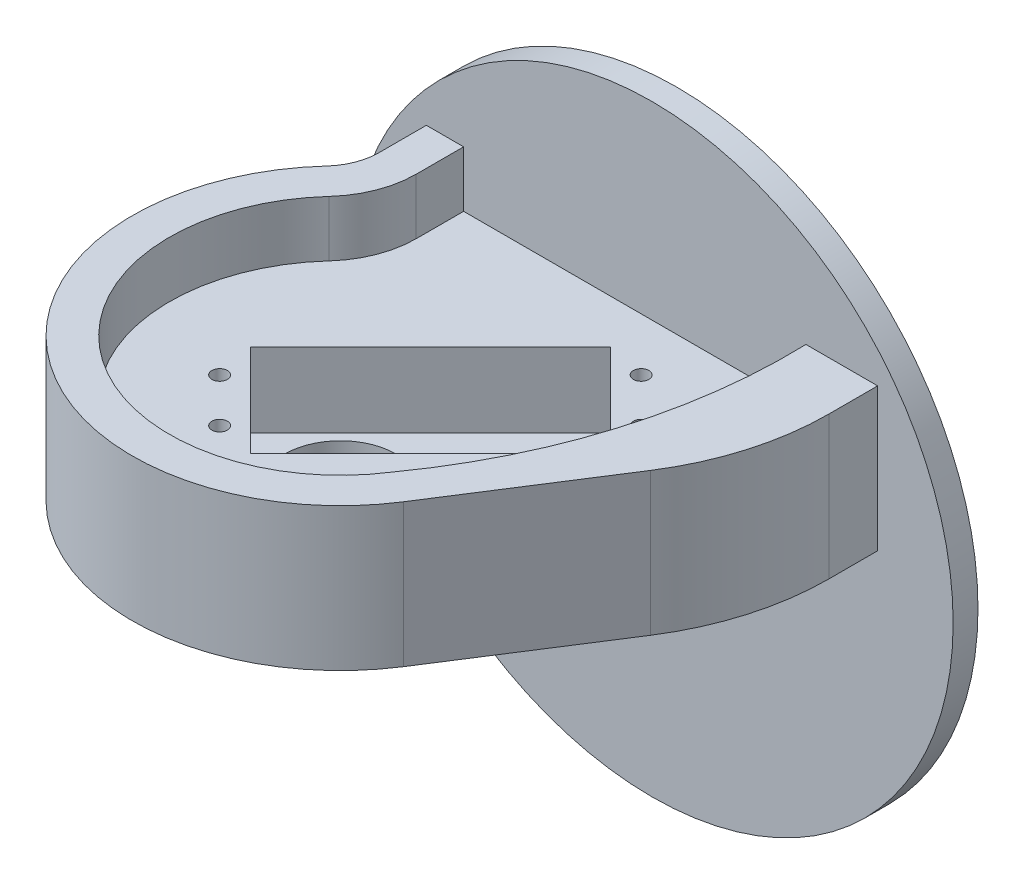
ISO-10303-21;
HEADER;
FILE_DESCRIPTION(('STEP AP214'),'2;1');
FILE_NAME('part.step','',(''),(''),'','','');
FILE_SCHEMA(('AUTOMOTIVE_DESIGN { 1 0 10303 214 1 1 1 1 }'));
ENDSEC;
DATA;
#1=APPLICATION_CONTEXT('core data for automotive mechanical design processes');
#2=APPLICATION_PROTOCOL_DEFINITION('international standard','automotive_design',2000,#1);
#3=PRODUCT_CONTEXT('',#1,'mechanical');
#4=PRODUCT('Part','Part','',(#3));
#5=PRODUCT_RELATED_PRODUCT_CATEGORY('part','',(#4));
#6=PRODUCT_DEFINITION_FORMATION('','',#4);
#7=PRODUCT_DEFINITION_CONTEXT('part definition',#1,'design');
#8=PRODUCT_DEFINITION('design','',#6,#7);
#9=PRODUCT_DEFINITION_SHAPE('','',#8);
#10=(LENGTH_UNIT() NAMED_UNIT(*) SI_UNIT(.MILLI.,.METRE.));
#11=(NAMED_UNIT(*) PLANE_ANGLE_UNIT() SI_UNIT($,.RADIAN.));
#12=(NAMED_UNIT(*) SI_UNIT($,.STERADIAN.) SOLID_ANGLE_UNIT());
#13=UNCERTAINTY_MEASURE_WITH_UNIT(LENGTH_MEASURE(1.E-05),#10,'distance_accuracy_value','');
#14=(GEOMETRIC_REPRESENTATION_CONTEXT(3) GLOBAL_UNCERTAINTY_ASSIGNED_CONTEXT((#13)) GLOBAL_UNIT_ASSIGNED_CONTEXT((#10,
#11,#12)) REPRESENTATION_CONTEXT('',''));
#15=CARTESIAN_POINT('',(0.,0.,0.));
#16=DIRECTION('',(0.,0.,1.));
#17=DIRECTION('',(1.,0.,0.));
#18=AXIS2_PLACEMENT_3D('',#15,#16,#17);
#19=CARTESIAN_POINT('',(-4.89,18.,11.86));
#20=DIRECTION('',(0.,-1.,0.));
#21=DIRECTION('',(0.,0.,-1.));
#22=AXIS2_PLACEMENT_3D('',#19,#20,#21);
#23=PLANE('',#22);
#24=DIRECTION('',(0.538635076023499,0.,-0.842539171123313));
#25=VECTOR('',#24,1.);
#26=CARTESIAN_POINT('',(24.7926549986743,18.,30.8361137283079));
#27=LINE('',#26,#25);
#28=CARTESIAN_POINT('',(9.27810564071832,18.,55.1041499893436));
#29=VERTEX_POINT('',#28);
#30=CARTESIAN_POINT('',(14.053379062148,18.,47.6346124685398));
#31=VERTEX_POINT('',#30);
#32=EDGE_CURVE('E304',#29,#31,#27,.T.);
#33=ORIENTED_EDGE('',*,*,#32,.T.);
#34=CARTESIAN_POINT('',(-58.1652068484387,18.,6.72647331414636));
#35=DIRECTION('',(0.,-1.,0.));
#36=DIRECTION('',(0.,0.,-1.));
#37=AXIS2_PLACEMENT_3D('',#34,#35,#36);
#38=CIRCLE('',#37,83.);
#39=CARTESIAN_POINT('',(24.79,18.,4.));
#40=VERTEX_POINT('',#39);
#41=EDGE_CURVE('E253',#31,#40,#38,.F.);
#42=ORIENTED_EDGE('',*,*,#41,.T.);
#43=DIRECTION('',(-1.,0.,0.));
#44=VECTOR('',#43,1.);
#45=CARTESIAN_POINT('',(-30.34,18.,4.));
#46=LINE('',#45,#44);
#47=CARTESIAN_POINT('',(-30.34,18.,4.));
#48=VERTEX_POINT('',#47);
#49=EDGE_CURVE('E292',#40,#48,#46,.T.);
#50=ORIENTED_EDGE('',*,*,#49,.T.);
#51=DIRECTION('',(0.,0.,1.));
#52=VECTOR('',#51,1.);
#53=CARTESIAN_POINT('',(-30.34,18.,4.));
#54=LINE('',#53,#52);
#55=CARTESIAN_POINT('',(-30.34,18.,11.64));
#56=VERTEX_POINT('',#55);
#57=EDGE_CURVE('E295',#48,#56,#54,.T.);
#58=ORIENTED_EDGE('',*,*,#57,.T.);
#59=CARTESIAN_POINT('',(-45.34,18.,11.64));
#60=DIRECTION('',(0.,-1.,0.));
#61=DIRECTION('',(0.,0.,-1.));
#62=AXIS2_PLACEMENT_3D('',#59,#60,#61);
#63=CIRCLE('',#62,15.);
#64=CARTESIAN_POINT('',(-34.2527184145767,18.,21.7430780975668));
#65=VERTEX_POINT('',#64);
#66=EDGE_CURVE('E299',#56,#65,#63,.T.);
#67=ORIENTED_EDGE('',*,*,#66,.T.);
#68=CARTESIAN_POINT('',(-13.91,18.,40.28));
#69=DIRECTION('',(0.,1.,0.));
#70=DIRECTION('',(0.,0.,1.));
#71=AXIS2_PLACEMENT_3D('',#68,#69,#70);
#72=CIRCLE('',#71,27.5216944629444);
#73=EDGE_CURVE('E302',#65,#29,#72,.T.);
#74=ORIENTED_EDGE('',*,*,#73,.T.);
#75=EDGE_LOOP('',(#33,#42,#50,#58,#67,#74));
#76=FACE_BOUND('',#75,.T.);
#77=DIRECTION('',(-0.707106781186547,0.,-0.707106781186548));
#78=VECTOR('',#77,1.);
#79=CARTESIAN_POINT('',(-1.86537879754133,18.,8.83537879754134));
#80=LINE('',#79,#78);
#81=CARTESIAN_POINT('',(15.2592424049174,18.,25.9600000000001));
#82=VERTEX_POINT('',#81);
#83=CARTESIAN_POINT('',(0.409999999999921,18.,11.1107575950826));
#84=VERTEX_POINT('',#83);
#85=EDGE_CURVE('E47',#82,#84,#80,.T.);
#86=ORIENTED_EDGE('',*,*,#85,.F.);
#87=DIRECTION('',(0.707106781186551,0.,-0.707106781186544));
#88=VECTOR('',#87,1.);
#89=CARTESIAN_POINT('',(12.2346212024587,18.,28.9846212024589));
#90=LINE('',#89,#88);
#91=CARTESIAN_POINT('',(-13.7321356237312,18.,54.9513780286484));
#92=VERTEX_POINT('',#91);
#93=EDGE_CURVE('E332',#92,#82,#90,.T.);
#94=ORIENTED_EDGE('',*,*,#93,.F.);
#95=DIRECTION('',(0.707106781186544,0.,0.707106781186551));
#96=VECTOR('',#95,1.);
#97=CARTESIAN_POINT('',(-30.8567568261899,18.,37.8267568261896));
#98=LINE('',#97,#96);
#99=CARTESIAN_POINT('',(-28.5813780286486,18.,40.1021356237308));
#100=VERTEX_POINT('',#99);
#101=EDGE_CURVE('E339',#100,#92,#98,.T.);
#102=ORIENTED_EDGE('',*,*,#101,.F.);
#103=DIRECTION('',(-0.707106781186551,0.,0.707106781186544));
#104=VECTOR('',#103,1.);
#105=CARTESIAN_POINT('',(-2.61462120245877,18.,14.1353787975413));
#106=LINE('',#105,#104);
#107=EDGE_CURVE('E342',#84,#100,#106,.T.);
#108=ORIENTED_EDGE('',*,*,#107,.F.);
#109=EDGE_LOOP('',(#86,#94,#102,#108));
#110=FACE_BOUND('',#109,.T.);
#111=CARTESIAN_POINT('',(-20.0960966544101,18.,53.5371644662753));
#112=DIRECTION('',(0.,-1.,0.));
#113=DIRECTION('',(0.,0.,-1.));
#114=AXIS2_PLACEMENT_3D('',#111,#112,#113);
#115=CIRCLE('',#114,1.25);
#116=CARTESIAN_POINT('',(-20.0960966544101,18.,52.2871644662753));
#117=VERTEX_POINT('',#116);
#118=EDGE_CURVE('E337',#117,#117,#115,.F.);
#119=ORIENTED_EDGE('',*,*,#118,.F.);
#120=EDGE_LOOP('',(#119));
#121=FACE_BOUND('',#120,.T.);
#122=CARTESIAN_POINT('',(-27.1671644662755,18.,46.4660966544098));
#123=DIRECTION('',(0.,-1.,0.));
#124=DIRECTION('',(0.,0.,-1.));
#125=AXIS2_PLACEMENT_3D('',#122,#123,#124);
#126=CIRCLE('',#125,1.25);
#127=CARTESIAN_POINT('',(-27.1671644662755,18.,45.2160966544098));
#128=VERTEX_POINT('',#127);
#129=EDGE_CURVE('E347',#128,#128,#126,.F.);
#130=ORIENTED_EDGE('',*,*,#129,.F.);
#131=EDGE_LOOP('',(#130));
#132=FACE_BOUND('',#131,.T.);
#133=CARTESIAN_POINT('',(6.7739610306791,18.,12.524971157456));
#134=DIRECTION('',(0.,-1.,0.));
#135=DIRECTION('',(0.,0.,-1.));
#136=AXIS2_PLACEMENT_3D('',#133,#134,#135);
#137=CIRCLE('',#136,1.25);
#138=CARTESIAN_POINT('',(6.7739610306791,18.,11.274971157456));
#139=VERTEX_POINT('',#138);
#140=EDGE_CURVE('E350',#139,#139,#137,.F.);
#141=ORIENTED_EDGE('',*,*,#140,.F.);
#142=EDGE_LOOP('',(#141));
#143=FACE_BOUND('',#142,.T.);
#144=CARTESIAN_POINT('',(13.8450288425444,18.,19.5960389693216));
#145=DIRECTION('',(0.,-1.,0.));
#146=DIRECTION('',(0.,0.,-1.));
#147=AXIS2_PLACEMENT_3D('',#144,#145,#146);
#148=CIRCLE('',#147,1.24999999999999);
#149=CARTESIAN_POINT('',(13.8450288425444,18.,18.3460389693216));
#150=VERTEX_POINT('',#149);
#151=EDGE_CURVE('E291',#150,#150,#148,.F.);
#152=ORIENTED_EDGE('',*,*,#151,.F.);
#153=EDGE_LOOP('',(#152));
#154=FACE_BOUND('',#153,.T.);
#155=ADVANCED_FACE('F39',(#76,#110,#121,#132,#143,#154),#23,.F.);
#156=CARTESIAN_POINT('',(0.,0.,4.));
#157=DIRECTION('',(0.,0.,1.));
#158=DIRECTION('',(1.,0.,0.));
#159=AXIS2_PLACEMENT_3D('',#156,#157,#158);
#160=PLANE('',#159);
#161=DIRECTION('',(0.,1.,0.));
#162=VECTOR('',#161,1.);
#163=CARTESIAN_POINT('',(36.34,-105.041154355093,4.));
#164=LINE('',#163,#162);
#165=CARTESIAN_POINT('',(36.34,4.,4.));
#166=VERTEX_POINT('',#165);
#167=CARTESIAN_POINT('',(36.34,27.,4.));
#168=VERTEX_POINT('',#167);
#169=EDGE_CURVE('E216',#166,#168,#164,.T.);
#170=ORIENTED_EDGE('',*,*,#169,.F.);
#171=DIRECTION('',(-1.,0.,0.));
#172=VECTOR('',#171,1.);
#173=CARTESIAN_POINT('',(-30.34,4.,4.));
#174=LINE('',#173,#172);
#175=CARTESIAN_POINT('',(-36.34,4.,4.));
#176=VERTEX_POINT('',#175);
#177=EDGE_CURVE('E54',#166,#176,#174,.T.);
#178=ORIENTED_EDGE('',*,*,#177,.T.);
#179=DIRECTION('',(0.,1.,0.));
#180=VECTOR('',#179,1.);
#181=CARTESIAN_POINT('',(-36.34,-105.041154355093,4.));
#182=LINE('',#181,#180);
#183=CARTESIAN_POINT('',(-36.34,27.,4.));
#184=VERTEX_POINT('',#183);
#185=EDGE_CURVE('E237',#176,#184,#182,.T.);
#186=ORIENTED_EDGE('',*,*,#185,.T.);
#187=DIRECTION('',(-1.,0.,0.));
#188=VECTOR('',#187,1.);
#189=CARTESIAN_POINT('',(-30.34,27.,4.));
#190=LINE('',#189,#188);
#191=CARTESIAN_POINT('',(-30.34,27.,4.));
#192=VERTEX_POINT('',#191);
#193=EDGE_CURVE('E193',#192,#184,#190,.T.);
#194=ORIENTED_EDGE('',*,*,#193,.F.);
#195=DIRECTION('',(0.,1.,0.));
#196=VECTOR('',#195,1.);
#197=CARTESIAN_POINT('',(-30.34,-105.041154355093,4.));
#198=LINE('',#197,#196);
#199=EDGE_CURVE('E247',#48,#192,#198,.T.);
#200=ORIENTED_EDGE('',*,*,#199,.F.);
#201=ORIENTED_EDGE('',*,*,#49,.F.);
#202=DIRECTION('',(0.,1.,0.));
#203=VECTOR('',#202,1.);
#204=CARTESIAN_POINT('',(24.79,-105.041154355093,4.));
#205=LINE('',#204,#203);
#206=CARTESIAN_POINT('',(24.79,27.,4.));
#207=VERTEX_POINT('',#206);
#208=EDGE_CURVE('E62',#40,#207,#205,.T.);
#209=ORIENTED_EDGE('',*,*,#208,.T.);
#210=DIRECTION('',(-1.,0.,0.));
#211=VECTOR('',#210,1.);
#212=CARTESIAN_POINT('',(30.34,27.,4.));
#213=LINE('',#212,#211);
#214=EDGE_CURVE('E181',#168,#207,#213,.T.);
#215=ORIENTED_EDGE('',*,*,#214,.F.);
#216=EDGE_LOOP('',(#170,#178,#186,#194,#200,#201,#209,#215));
#217=FACE_BOUND('',#216,.T.);
#218=CARTESIAN_POINT('',(0.,0.,4.));
#219=DIRECTION('',(0.,0.,1.));
#220=DIRECTION('',(1.,0.,0.));
#221=AXIS2_PLACEMENT_3D('',#218,#219,#220);
#222=CIRCLE('',#221,3.75);
#223=CARTESIAN_POINT('',(3.75,0.,4.));
#224=VERTEX_POINT('',#223);
#225=EDGE_CURVE('E310',#224,#224,#222,.T.);
#226=ORIENTED_EDGE('',*,*,#225,.F.);
#227=EDGE_LOOP('',(#226));
#228=FACE_BOUND('',#227,.T.);
#229=CARTESIAN_POINT('',(-7.25,0.,4.));
#230=DIRECTION('',(0.,0.,1.));
#231=DIRECTION('',(1.,0.,0.));
#232=AXIS2_PLACEMENT_3D('',#229,#230,#231);
#233=CIRCLE('',#232,1.5);
#234=CARTESIAN_POINT('',(-5.75,0.,4.));
#235=VERTEX_POINT('',#234);
#236=EDGE_CURVE('E323',#235,#235,#233,.T.);
#237=ORIENTED_EDGE('',*,*,#236,.F.);
#238=EDGE_LOOP('',(#237));
#239=FACE_BOUND('',#238,.T.);
#240=CARTESIAN_POINT('',(0.,0.,4.));
#241=DIRECTION('',(0.,0.,1.));
#242=DIRECTION('',(1.,0.,0.));
#243=AXIS2_PLACEMENT_3D('',#240,#241,#242);
#244=CIRCLE('',#243,48.5);
#245=CARTESIAN_POINT('',(48.5,0.,4.));
#246=VERTEX_POINT('',#245);
#247=EDGE_CURVE('E329',#246,#246,#244,.T.);
#248=ORIENTED_EDGE('',*,*,#247,.T.);
#249=EDGE_LOOP('',(#248));
#250=FACE_BOUND('',#249,.T.);
#251=CARTESIAN_POINT('',(7.25,0.,4.));
#252=DIRECTION('',(0.,0.,1.));
#253=DIRECTION('',(1.,0.,0.));
#254=AXIS2_PLACEMENT_3D('',#251,#252,#253);
#255=CIRCLE('',#254,1.5);
#256=CARTESIAN_POINT('',(8.75,0.,4.));
#257=VERTEX_POINT('',#256);
#258=EDGE_CURVE('E317',#257,#257,#255,.T.);
#259=ORIENTED_EDGE('',*,*,#258,.F.);
#260=EDGE_LOOP('',(#259));
#261=FACE_BOUND('',#260,.T.);
#262=ADVANCED_FACE('F358',(#217,#228,#239,#250,#261),#160,.T.);
#263=CARTESIAN_POINT('',(0.,0.,0.));
#264=DIRECTION('',(0.,0.,1.));
#265=DIRECTION('',(1.,0.,0.));
#266=AXIS2_PLACEMENT_3D('',#263,#264,#265);
#267=PLANE('',#266);
#268=CARTESIAN_POINT('',(0.,0.,0.));
#269=DIRECTION('',(0.,0.,1.));
#270=DIRECTION('',(1.,0.,0.));
#271=AXIS2_PLACEMENT_3D('',#268,#269,#270);
#272=CIRCLE('',#271,48.5);
#273=CARTESIAN_POINT('',(48.5,0.,0.));
#274=VERTEX_POINT('',#273);
#275=EDGE_CURVE('E326',#274,#274,#272,.T.);
#276=ORIENTED_EDGE('',*,*,#275,.F.);
#277=EDGE_LOOP('',(#276));
#278=FACE_BOUND('',#277,.T.);
#279=CARTESIAN_POINT('',(-7.25,0.,0.));
#280=DIRECTION('',(0.,0.,1.));
#281=DIRECTION('',(1.,0.,0.));
#282=AXIS2_PLACEMENT_3D('',#279,#280,#281);
#283=CIRCLE('',#282,1.5);
#284=CARTESIAN_POINT('',(-5.75,0.,0.));
#285=VERTEX_POINT('',#284);
#286=EDGE_CURVE('E320',#285,#285,#283,.T.);
#287=ORIENTED_EDGE('',*,*,#286,.T.);
#288=EDGE_LOOP('',(#287));
#289=FACE_BOUND('',#288,.T.);
#290=CARTESIAN_POINT('',(7.25,0.,0.));
#291=DIRECTION('',(0.,0.,1.));
#292=DIRECTION('',(1.,0.,0.));
#293=AXIS2_PLACEMENT_3D('',#290,#291,#292);
#294=CIRCLE('',#293,1.5);
#295=CARTESIAN_POINT('',(8.75,0.,0.));
#296=VERTEX_POINT('',#295);
#297=EDGE_CURVE('E314',#296,#296,#294,.T.);
#298=ORIENTED_EDGE('',*,*,#297,.T.);
#299=EDGE_LOOP('',(#298));
#300=FACE_BOUND('',#299,.T.);
#301=ADVANCED_FACE('F365',(#278,#289,#300),#267,.F.);
#302=CARTESIAN_POINT('',(0.,0.,4.));
#303=DIRECTION('',(0.,0.,-1.));
#304=DIRECTION('',(-1.,0.,0.));
#305=AXIS2_PLACEMENT_3D('',#302,#303,#304);
#306=CYLINDRICAL_SURFACE('',#305,48.5);
#307=ORIENTED_EDGE('',*,*,#247,.F.);
#308=EDGE_LOOP('',(#307));
#309=FACE_BOUND('',#308,.T.);
#310=ORIENTED_EDGE('',*,*,#275,.T.);
#311=EDGE_LOOP('',(#310));
#312=FACE_BOUND('',#311,.T.);
#313=ADVANCED_FACE('F41',(#309,#312),#306,.T.);
#314=CARTESIAN_POINT('',(-7.25,0.,4.));
#315=DIRECTION('',(0.,0.,-1.));
#316=DIRECTION('',(-1.,0.,0.));
#317=AXIS2_PLACEMENT_3D('',#314,#315,#316);
#318=CYLINDRICAL_SURFACE('',#317,1.5);
#319=ORIENTED_EDGE('',*,*,#236,.T.);
#320=EDGE_LOOP('',(#319));
#321=FACE_BOUND('',#320,.T.);
#322=ORIENTED_EDGE('',*,*,#286,.F.);
#323=EDGE_LOOP('',(#322));
#324=FACE_BOUND('',#323,.T.);
#325=ADVANCED_FACE('F390',(#321,#324),#318,.F.);
#326=CARTESIAN_POINT('',(7.25,0.,4.));
#327=DIRECTION('',(0.,0.,-1.));
#328=DIRECTION('',(-1.,0.,0.));
#329=AXIS2_PLACEMENT_3D('',#326,#327,#328);
#330=CYLINDRICAL_SURFACE('',#329,1.5);
#331=ORIENTED_EDGE('',*,*,#258,.T.);
#332=EDGE_LOOP('',(#331));
#333=FACE_BOUND('',#332,.T.);
#334=ORIENTED_EDGE('',*,*,#297,.F.);
#335=EDGE_LOOP('',(#334));
#336=FACE_BOUND('',#335,.T.);
#337=ADVANCED_FACE('F386',(#333,#336),#330,.F.);
#338=CARTESIAN_POINT('',(0.,0.,2.5));
#339=DIRECTION('',(0.,0.,1.));
#340=DIRECTION('',(1.,0.,0.));
#341=AXIS2_PLACEMENT_3D('',#338,#339,#340);
#342=CYLINDRICAL_SURFACE('',#341,3.75);
#343=CARTESIAN_POINT('',(0.,0.,2.5));
#344=DIRECTION('',(0.,0.,1.));
#345=DIRECTION('',(1.,0.,0.));
#346=AXIS2_PLACEMENT_3D('',#343,#344,#345);
#347=CIRCLE('',#346,3.75);
#348=CARTESIAN_POINT('',(3.75,0.,2.5));
#349=VERTEX_POINT('',#348);
#350=EDGE_CURVE('E311',#349,#349,#347,.T.);
#351=ORIENTED_EDGE('',*,*,#350,.F.);
#352=EDGE_LOOP('',(#351));
#353=FACE_BOUND('',#352,.T.);
#354=ORIENTED_EDGE('',*,*,#225,.T.);
#355=EDGE_LOOP('',(#354));
#356=FACE_BOUND('',#355,.T.);
#357=ADVANCED_FACE('F382',(#353,#356),#342,.F.);
#358=CARTESIAN_POINT('',(0.,0.,2.5));
#359=DIRECTION('',(0.,0.,1.));
#360=DIRECTION('',(1.,0.,0.));
#361=AXIS2_PLACEMENT_3D('',#358,#359,#360);
#362=PLANE('',#361);
#363=ORIENTED_EDGE('',*,*,#350,.T.);
#364=EDGE_LOOP('',(#363));
#365=FACE_BOUND('',#364,.T.);
#366=ADVANCED_FACE('F376',(#365),#362,.T.);
#367=CARTESIAN_POINT('',(-4.89,4.,11.86));
#368=DIRECTION('',(0.,-1.,0.));
#369=DIRECTION('',(0.,0.,-1.));
#370=AXIS2_PLACEMENT_3D('',#367,#368,#369);
#371=PLANE('',#370);
#372=DIRECTION('',(0.,0.,1.));
#373=VECTOR('',#372,1.);
#374=CARTESIAN_POINT('',(-36.34,4.,4.));
#375=LINE('',#374,#373);
#376=CARTESIAN_POINT('',(-36.34,4.,11.64));
#377=VERTEX_POINT('',#376);
#378=EDGE_CURVE('E234',#176,#377,#375,.T.);
#379=ORIENTED_EDGE('',*,*,#378,.F.);
#380=ORIENTED_EDGE('',*,*,#177,.F.);
#381=DIRECTION('',(0.,0.,-1.));
#382=VECTOR('',#381,1.);
#383=CARTESIAN_POINT('',(36.34,4.,11.86));
#384=LINE('',#383,#382);
#385=CARTESIAN_POINT('',(36.34,4.,11.86));
#386=VERTEX_POINT('',#385);
#387=EDGE_CURVE('E213',#386,#166,#384,.T.);
#388=ORIENTED_EDGE('',*,*,#387,.F.);
#389=CARTESIAN_POINT('',(-4.89,4.,11.86));
#390=DIRECTION('',(0.,-1.,0.));
#391=DIRECTION('',(0.,0.,-1.));
#392=AXIS2_PLACEMENT_3D('',#389,#390,#391);
#393=CIRCLE('',#392,41.23);
#394=CARTESIAN_POINT('',(29.8478900254142,4.,34.0679241844488));
#395=VERTEX_POINT('',#394);
#396=EDGE_CURVE('E218',#395,#386,#393,.F.);
#397=ORIENTED_EDGE('',*,*,#396,.F.);
#398=DIRECTION('',(0.538635076023499,0.,-0.842539171123313));
#399=VECTOR('',#398,1.);
#400=CARTESIAN_POINT('',(14.3333406674582,4.,58.3359604454846));
#401=LINE('',#400,#399);
#402=CARTESIAN_POINT('',(14.3333406674582,4.,58.3359604454846));
#403=VERTEX_POINT('',#402);
#404=EDGE_CURVE('E222',#403,#395,#401,.T.);
#405=ORIENTED_EDGE('',*,*,#404,.F.);
#406=CARTESIAN_POINT('',(-13.91,4.,40.28));
#407=DIRECTION('',(0.,-1.,0.));
#408=DIRECTION('',(0.,0.,-1.));
#409=AXIS2_PLACEMENT_3D('',#406,#407,#408);
#410=CIRCLE('',#409,33.5216944629444);
#411=CARTESIAN_POINT('',(-38.687631048746,4.,17.7018468585401));
#412=VERTEX_POINT('',#411);
#413=EDGE_CURVE('E226',#412,#403,#410,.F.);
#414=ORIENTED_EDGE('',*,*,#413,.F.);
#415=CARTESIAN_POINT('',(-45.34,4.,11.64));
#416=DIRECTION('',(0.,-1.,0.));
#417=DIRECTION('',(0.,0.,-1.));
#418=AXIS2_PLACEMENT_3D('',#415,#416,#417);
#419=CIRCLE('',#418,8.99999999999999);
#420=EDGE_CURVE('E230',#377,#412,#419,.T.);
#421=ORIENTED_EDGE('',*,*,#420,.F.);
#422=EDGE_LOOP('',(#379,#380,#388,#397,#405,#414,#421));
#423=FACE_BOUND('',#422,.T.);
#424=CARTESIAN_POINT('',(-58.1652068484387,4.,6.72647331414636));
#425=DIRECTION('',(0.,-1.,0.));
#426=DIRECTION('',(0.,0.,-1.));
#427=AXIS2_PLACEMENT_3D('',#424,#425,#426);
#428=CIRCLE('',#427,83.);
#429=CARTESIAN_POINT('',(14.053379062148,4.,47.6346124685398));
#430=VERTEX_POINT('',#429);
#431=CARTESIAN_POINT('',(9.27810564071831,4.,55.1041499893436));
#432=VERTEX_POINT('',#431);
#433=EDGE_CURVE('E172',#430,#432,#428,.T.);
#434=ORIENTED_EDGE('',*,*,#433,.F.);
#435=DIRECTION('',(0.538635076023499,0.,-0.842539171123313));
#436=VECTOR('',#435,1.);
#437=CARTESIAN_POINT('',(24.7926549986743,4.,30.8361137283079));
#438=LINE('',#437,#436);
#439=EDGE_CURVE('E296',#432,#430,#438,.T.);
#440=ORIENTED_EDGE('',*,*,#439,.F.);
#441=EDGE_LOOP('',(#434,#440));
#442=FACE_BOUND('',#441,.T.);
#443=CARTESIAN_POINT('',(-13.91,4.,40.28));
#444=DIRECTION('',(0.,1.,0.));
#445=DIRECTION('',(0.,0.,1.));
#446=AXIS2_PLACEMENT_3D('',#443,#444,#445);
#447=CIRCLE('',#446,9.00000000000001);
#448=CARTESIAN_POINT('',(-13.91,4.,49.28));
#449=VERTEX_POINT('',#448);
#450=EDGE_CURVE('E288',#449,#449,#447,.T.);
#451=ORIENTED_EDGE('',*,*,#450,.T.);
#452=EDGE_LOOP('',(#451));
#453=FACE_BOUND('',#452,.T.);
#454=ADVANCED_FACE('F372',(#423,#442,#453),#371,.T.);
#455=CARTESIAN_POINT('',(24.7926549986743,18.,30.8361137283079));
#456=DIRECTION('',(-0.842539171123313,0.,-0.538635076023498));
#457=DIRECTION('',(-0.538635076023499,0.,0.842539171123314));
#458=AXIS2_PLACEMENT_3D('',#455,#456,#457);
#459=PLANE('',#458);
#460=ORIENTED_EDGE('',*,*,#439,.T.);
#461=DIRECTION('',(0.,1.,0.));
#462=VECTOR('',#461,1.);
#463=CARTESIAN_POINT('',(14.053379062148,-105.041154355093,47.6346124685398));
#464=LINE('',#463,#462);
#465=EDGE_CURVE('E11',#430,#31,#464,.T.);
#466=ORIENTED_EDGE('',*,*,#465,.T.);
#467=ORIENTED_EDGE('',*,*,#32,.F.);
#468=DIRECTION('',(0.,-1.,0.));
#469=VECTOR('',#468,1.);
#470=CARTESIAN_POINT('',(9.27810564071831,18.,55.1041499893436));
#471=LINE('',#470,#469);
#472=EDGE_CURVE('E167',#29,#432,#471,.T.);
#473=ORIENTED_EDGE('',*,*,#472,.T.);
#474=EDGE_LOOP('',(#460,#466,#467,#473));
#475=FACE_BOUND('',#474,.T.);
#476=ADVANCED_FACE('F375',(#475),#459,.F.);
#477=CARTESIAN_POINT('',(-13.91,18.,40.28));
#478=DIRECTION('',(0.,-1.,0.));
#479=DIRECTION('',(0.,0.,-1.));
#480=AXIS2_PLACEMENT_3D('',#477,#478,#479);
#481=CYLINDRICAL_SURFACE('',#480,9.00000000000001);
#482=CARTESIAN_POINT('',(-13.91,6.,40.28));
#483=DIRECTION('',(0.,-1.,0.));
#484=DIRECTION('',(0.,0.,-1.));
#485=AXIS2_PLACEMENT_3D('',#482,#483,#484);
#486=CIRCLE('',#485,9.00000000000001);
#487=CARTESIAN_POINT('',(-13.91,6.,31.28));
#488=VERTEX_POINT('',#487);
#489=EDGE_CURVE('E287',#488,#488,#486,.T.);
#490=ORIENTED_EDGE('',*,*,#489,.F.);
#491=EDGE_LOOP('',(#490));
#492=FACE_BOUND('',#491,.T.);
#493=ORIENTED_EDGE('',*,*,#450,.F.);
#494=EDGE_LOOP('',(#493));
#495=FACE_BOUND('',#494,.T.);
#496=ADVANCED_FACE('F370',(#492,#495),#481,.F.);
#497=CARTESIAN_POINT('',(0.409999999999921,48.5,11.1107575950826));
#498=DIRECTION('',(-0.707106781186548,0.,0.707106781186547));
#499=DIRECTION('',(0.707106781186547,0.,0.707106781186548));
#500=AXIS2_PLACEMENT_3D('',#497,#498,#499);
#501=PLANE('',#500);
#502=ORIENTED_EDGE('',*,*,#85,.T.);
#503=DIRECTION('',(0.,-1.,0.));
#504=VECTOR('',#503,1.);
#505=CARTESIAN_POINT('',(0.409999999999921,48.5,11.1107575950826));
#506=LINE('',#505,#504);
#507=CARTESIAN_POINT('',(0.409999999999921,6.,11.1107575950826));
#508=VERTEX_POINT('',#507);
#509=EDGE_CURVE('E285',#84,#508,#506,.T.);
#510=ORIENTED_EDGE('',*,*,#509,.T.);
#511=DIRECTION('',(-0.707106781186547,0.,-0.707106781186549));
#512=VECTOR('',#511,1.);
#513=CARTESIAN_POINT('',(0.409999999999921,6.,11.1107575950826));
#514=LINE('',#513,#512);
#515=CARTESIAN_POINT('',(15.2592424049174,6.,25.9600000000001));
#516=VERTEX_POINT('',#515);
#517=EDGE_CURVE('E259',#516,#508,#514,.T.);
#518=ORIENTED_EDGE('',*,*,#517,.F.);
#519=DIRECTION('',(0.,-1.,0.));
#520=VECTOR('',#519,1.);
#521=CARTESIAN_POINT('',(15.2592424049174,48.5,25.9600000000001));
#522=LINE('',#521,#520);
#523=EDGE_CURVE('E279',#82,#516,#522,.T.);
#524=ORIENTED_EDGE('',*,*,#523,.F.);
#525=EDGE_LOOP('',(#502,#510,#518,#524));
#526=FACE_BOUND('',#525,.T.);
#527=ADVANCED_FACE('F442',(#526),#501,.T.);
#528=CARTESIAN_POINT('',(0.409999999999921,48.5,11.1107575950826));
#529=DIRECTION('',(0.707106781186544,0.,0.707106781186551));
#530=DIRECTION('',(0.707106781186551,0.,-0.707106781186544));
#531=AXIS2_PLACEMENT_3D('',#528,#529,#530);
#532=PLANE('',#531);
#533=ORIENTED_EDGE('',*,*,#107,.T.);
#534=DIRECTION('',(0.,-1.,0.));
#535=VECTOR('',#534,1.);
#536=CARTESIAN_POINT('',(-28.5813780286486,48.5,40.1021356237308));
#537=LINE('',#536,#535);
#538=CARTESIAN_POINT('',(-28.5813780286486,6.,40.1021356237308));
#539=VERTEX_POINT('',#538);
#540=EDGE_CURVE('E283',#100,#539,#537,.T.);
#541=ORIENTED_EDGE('',*,*,#540,.T.);
#542=DIRECTION('',(-0.707106781186551,0.,0.707106781186544));
#543=VECTOR('',#542,1.);
#544=CARTESIAN_POINT('',(0.409999999999921,6.,11.1107575950826));
#545=LINE('',#544,#543);
#546=EDGE_CURVE('E270',#508,#539,#545,.T.);
#547=ORIENTED_EDGE('',*,*,#546,.F.);
#548=ORIENTED_EDGE('',*,*,#509,.F.);
#549=EDGE_LOOP('',(#533,#541,#547,#548));
#550=FACE_BOUND('',#549,.T.);
#551=ADVANCED_FACE('F452',(#550),#532,.T.);
#552=CARTESIAN_POINT('',(-28.5813780286486,48.5,40.1021356237308));
#553=DIRECTION('',(0.707106781186551,0.,-0.707106781186544));
#554=DIRECTION('',(-0.707106781186544,0.,-0.707106781186551));
#555=AXIS2_PLACEMENT_3D('',#552,#553,#554);
#556=PLANE('',#555);
#557=ORIENTED_EDGE('',*,*,#101,.T.);
#558=DIRECTION('',(0.,-1.,0.));
#559=VECTOR('',#558,1.);
#560=CARTESIAN_POINT('',(-13.7321356237312,48.5,54.9513780286484));
#561=LINE('',#560,#559);
#562=CARTESIAN_POINT('',(-13.7321356237312,6.,54.9513780286484));
#563=VERTEX_POINT('',#562);
#564=EDGE_CURVE('E281',#92,#563,#561,.T.);
#565=ORIENTED_EDGE('',*,*,#564,.T.);
#566=DIRECTION('',(0.707106781186544,0.,0.707106781186551));
#567=VECTOR('',#566,1.);
#568=CARTESIAN_POINT('',(-28.5813780286486,6.,40.1021356237308));
#569=LINE('',#568,#567);
#570=EDGE_CURVE('E273',#539,#563,#569,.T.);
#571=ORIENTED_EDGE('',*,*,#570,.F.);
#572=ORIENTED_EDGE('',*,*,#540,.F.);
#573=EDGE_LOOP('',(#557,#565,#571,#572));
#574=FACE_BOUND('',#573,.T.);
#575=ADVANCED_FACE('F460',(#574),#556,.T.);
#576=CARTESIAN_POINT('',(15.2592424049174,48.5,25.9600000000001));
#577=DIRECTION('',(-0.707106781186544,0.,-0.707106781186551));
#578=DIRECTION('',(-0.707106781186551,0.,0.707106781186544));
#579=AXIS2_PLACEMENT_3D('',#576,#577,#578);
#580=PLANE('',#579);
#581=ORIENTED_EDGE('',*,*,#93,.T.);
#582=ORIENTED_EDGE('',*,*,#523,.T.);
#583=DIRECTION('',(0.707106781186551,0.,-0.707106781186544));
#584=VECTOR('',#583,1.);
#585=CARTESIAN_POINT('',(15.2592424049174,6.,25.9600000000001));
#586=LINE('',#585,#584);
#587=EDGE_CURVE('E276',#563,#516,#586,.T.);
#588=ORIENTED_EDGE('',*,*,#587,.F.);
#589=ORIENTED_EDGE('',*,*,#564,.F.);
#590=EDGE_LOOP('',(#581,#582,#588,#589));
#591=FACE_BOUND('',#590,.T.);
#592=ADVANCED_FACE('F469',(#591),#580,.T.);
#593=CARTESIAN_POINT('',(0.,6.,0.));
#594=DIRECTION('',(0.,-1.,0.));
#595=DIRECTION('',(0.,0.,-1.));
#596=AXIS2_PLACEMENT_3D('',#593,#594,#595);
#597=PLANE('',#596);
#598=ORIENTED_EDGE('',*,*,#489,.T.);
#599=EDGE_LOOP('',(#598));
#600=FACE_BOUND('',#599,.T.);
#601=ORIENTED_EDGE('',*,*,#517,.T.);
#602=ORIENTED_EDGE('',*,*,#546,.T.);
#603=ORIENTED_EDGE('',*,*,#570,.T.);
#604=ORIENTED_EDGE('',*,*,#587,.T.);
#605=EDGE_LOOP('',(#601,#602,#603,#604));
#606=FACE_BOUND('',#605,.T.);
#607=ADVANCED_FACE('F478',(#600,#606),#597,.F.);
#608=CARTESIAN_POINT('',(-20.0960966544101,48.5,53.5371644662753));
#609=DIRECTION('',(0.,-1.,0.));
#610=DIRECTION('',(0.,0.,-1.));
#611=AXIS2_PLACEMENT_3D('',#608,#609,#610);
#612=CYLINDRICAL_SURFACE('',#611,1.25);
#613=CARTESIAN_POINT('',(-20.0960966544101,6.,53.5371644662753));
#614=DIRECTION('',(0.,1.,0.));
#615=DIRECTION('',(0.,0.,1.));
#616=AXIS2_PLACEMENT_3D('',#613,#614,#615);
#617=CIRCLE('',#616,1.25);
#618=CARTESIAN_POINT('',(-20.0960966544101,6.,54.7871644662753));
#619=VERTEX_POINT('',#618);
#620=EDGE_CURVE('E256',#619,#619,#617,.T.);
#621=ORIENTED_EDGE('',*,*,#620,.F.);
#622=EDGE_LOOP('',(#621));
#623=FACE_BOUND('',#622,.T.);
#624=ORIENTED_EDGE('',*,*,#118,.T.);
#625=EDGE_LOOP('',(#624));
#626=FACE_BOUND('',#625,.T.);
#627=ADVANCED_FACE('F487',(#623,#626),#612,.F.);
#628=CARTESIAN_POINT('',(-20.0960966544101,6.,53.5371644662753));
#629=DIRECTION('',(0.,1.,0.));
#630=DIRECTION('',(0.,0.,1.));
#631=AXIS2_PLACEMENT_3D('',#628,#629,#630);
#632=PLANE('',#631);
#633=ORIENTED_EDGE('',*,*,#620,.T.);
#634=EDGE_LOOP('',(#633));
#635=FACE_BOUND('',#634,.T.);
#636=ADVANCED_FACE('F496',(#635),#632,.T.);
#637=CARTESIAN_POINT('',(-27.1671644662755,48.5,46.4660966544098));
#638=DIRECTION('',(0.,-1.,0.));
#639=DIRECTION('',(0.,0.,-1.));
#640=AXIS2_PLACEMENT_3D('',#637,#638,#639);
#641=CYLINDRICAL_SURFACE('',#640,1.25);
#642=CARTESIAN_POINT('',(-27.1671644662755,6.,46.4660966544098));
#643=DIRECTION('',(0.,1.,0.));
#644=DIRECTION('',(0.,0.,1.));
#645=AXIS2_PLACEMENT_3D('',#642,#643,#644);
#646=CIRCLE('',#645,1.25);
#647=CARTESIAN_POINT('',(-27.1671644662755,6.,47.7160966544098));
#648=VERTEX_POINT('',#647);
#649=EDGE_CURVE('E260',#648,#648,#646,.T.);
#650=ORIENTED_EDGE('',*,*,#649,.F.);
#651=EDGE_LOOP('',(#650));
#652=FACE_BOUND('',#651,.T.);
#653=ORIENTED_EDGE('',*,*,#129,.T.);
#654=EDGE_LOOP('',(#653));
#655=FACE_BOUND('',#654,.T.);
#656=ADVANCED_FACE('F505',(#652,#655),#641,.F.);
#657=CARTESIAN_POINT('',(-27.1671644662755,6.,46.4660966544098));
#658=DIRECTION('',(0.,1.,0.));
#659=DIRECTION('',(0.,0.,1.));
#660=AXIS2_PLACEMENT_3D('',#657,#658,#659);
#661=PLANE('',#660);
#662=ORIENTED_EDGE('',*,*,#649,.T.);
#663=EDGE_LOOP('',(#662));
#664=FACE_BOUND('',#663,.T.);
#665=ADVANCED_FACE('F514',(#664),#661,.T.);
#666=CARTESIAN_POINT('',(6.7739610306791,48.5,12.524971157456));
#667=DIRECTION('',(0.,-1.,0.));
#668=DIRECTION('',(0.,0.,-1.));
#669=AXIS2_PLACEMENT_3D('',#666,#667,#668);
#670=CYLINDRICAL_SURFACE('',#669,1.25);
#671=CARTESIAN_POINT('',(6.7739610306791,6.,12.524971157456));
#672=DIRECTION('',(0.,1.,0.));
#673=DIRECTION('',(0.,0.,-1.));
#674=AXIS2_PLACEMENT_3D('',#671,#672,#673);
#675=CIRCLE('',#674,1.25);
#676=CARTESIAN_POINT('',(6.7739610306791,6.,11.274971157456));
#677=VERTEX_POINT('',#676);
#678=EDGE_CURVE('E263',#677,#677,#675,.T.);
#679=ORIENTED_EDGE('',*,*,#678,.F.);
#680=EDGE_LOOP('',(#679));
#681=FACE_BOUND('',#680,.T.);
#682=ORIENTED_EDGE('',*,*,#140,.T.);
#683=EDGE_LOOP('',(#682));
#684=FACE_BOUND('',#683,.T.);
#685=ADVANCED_FACE('F523',(#681,#684),#670,.F.);
#686=CARTESIAN_POINT('',(6.7739610306791,6.,12.524971157456));
#687=DIRECTION('',(0.,-1.,0.));
#688=DIRECTION('',(0.,0.,-1.));
#689=AXIS2_PLACEMENT_3D('',#686,#687,#688);
#690=PLANE('',#689);
#691=ORIENTED_EDGE('',*,*,#678,.T.);
#692=EDGE_LOOP('',(#691));
#693=FACE_BOUND('',#692,.T.);
#694=ADVANCED_FACE('F532',(#693),#690,.F.);
#695=CARTESIAN_POINT('',(13.8450288425444,48.5,19.5960389693216));
#696=DIRECTION('',(0.,-1.,0.));
#697=DIRECTION('',(0.,0.,-1.));
#698=AXIS2_PLACEMENT_3D('',#695,#696,#697);
#699=CYLINDRICAL_SURFACE('',#698,1.24999999999999);
#700=CARTESIAN_POINT('',(13.8450288425444,6.,19.5960389693216));
#701=DIRECTION('',(0.,1.,0.));
#702=DIRECTION('',(0.,0.,-1.));
#703=AXIS2_PLACEMENT_3D('',#700,#701,#702);
#704=CIRCLE('',#703,1.24999999999999);
#705=CARTESIAN_POINT('',(13.8450288425444,6.,18.3460389693216));
#706=VERTEX_POINT('',#705);
#707=EDGE_CURVE('E255',#706,#706,#704,.T.);
#708=ORIENTED_EDGE('',*,*,#707,.F.);
#709=EDGE_LOOP('',(#708));
#710=FACE_BOUND('',#709,.T.);
#711=ORIENTED_EDGE('',*,*,#151,.T.);
#712=EDGE_LOOP('',(#711));
#713=FACE_BOUND('',#712,.T.);
#714=ADVANCED_FACE('F355',(#710,#713),#699,.F.);
#715=CARTESIAN_POINT('',(13.8450288425444,6.,19.5960389693216));
#716=DIRECTION('',(0.,-1.,0.));
#717=DIRECTION('',(0.,0.,-1.));
#718=AXIS2_PLACEMENT_3D('',#715,#716,#717);
#719=PLANE('',#718);
#720=ORIENTED_EDGE('',*,*,#707,.T.);
#721=EDGE_LOOP('',(#720));
#722=FACE_BOUND('',#721,.T.);
#723=ADVANCED_FACE('F548',(#722),#719,.F.);
#724=CARTESIAN_POINT('',(-30.34,-105.041154355093,4.));
#725=DIRECTION('',(1.,0.,0.));
#726=DIRECTION('',(0.,0.,-1.));
#727=AXIS2_PLACEMENT_3D('',#724,#725,#726);
#728=PLANE('',#727);
#729=ORIENTED_EDGE('',*,*,#57,.F.);
#730=ORIENTED_EDGE('',*,*,#199,.T.);
#731=DIRECTION('',(0.,0.,-1.));
#732=VECTOR('',#731,1.);
#733=CARTESIAN_POINT('',(-30.34,27.,4.));
#734=LINE('',#733,#732);
#735=CARTESIAN_POINT('',(-30.34,27.,11.64));
#736=VERTEX_POINT('',#735);
#737=EDGE_CURVE('E187',#736,#192,#734,.T.);
#738=ORIENTED_EDGE('',*,*,#737,.F.);
#739=DIRECTION('',(0.,1.,0.));
#740=VECTOR('',#739,1.);
#741=CARTESIAN_POINT('',(-30.34,-105.041154355093,11.64));
#742=LINE('',#741,#740);
#743=EDGE_CURVE('E249',#56,#736,#742,.T.);
#744=ORIENTED_EDGE('',*,*,#743,.F.);
#745=EDGE_LOOP('',(#729,#730,#738,#744));
#746=FACE_BOUND('',#745,.T.);
#747=ADVANCED_FACE('F556',(#746),#728,.T.);
#748=CARTESIAN_POINT('',(-45.34,-105.041154355093,11.64));
#749=DIRECTION('',(0.,1.,0.));
#750=DIRECTION('',(0.,0.,1.));
#751=AXIS2_PLACEMENT_3D('',#748,#749,#750);
#752=CYLINDRICAL_SURFACE('',#751,15.);
#753=ORIENTED_EDGE('',*,*,#66,.F.);
#754=ORIENTED_EDGE('',*,*,#743,.T.);
#755=CARTESIAN_POINT('',(-45.34,27.,11.64));
#756=DIRECTION('',(0.,1.,0.));
#757=DIRECTION('',(0.,0.,1.));
#758=AXIS2_PLACEMENT_3D('',#755,#756,#757);
#759=CIRCLE('',#758,15.);
#760=CARTESIAN_POINT('',(-34.2527184145767,27.,21.7430780975668));
#761=VERTEX_POINT('',#760);
#762=EDGE_CURVE('E185',#761,#736,#759,.T.);
#763=ORIENTED_EDGE('',*,*,#762,.F.);
#764=DIRECTION('',(0.,1.,0.));
#765=VECTOR('',#764,1.);
#766=CARTESIAN_POINT('',(-34.2527184145767,-105.041154355093,21.7430780975668));
#767=LINE('',#766,#765);
#768=EDGE_CURVE('E171',#65,#761,#767,.T.);
#769=ORIENTED_EDGE('',*,*,#768,.F.);
#770=EDGE_LOOP('',(#753,#754,#763,#769));
#771=FACE_BOUND('',#770,.T.);
#772=ADVANCED_FACE('F577',(#771),#752,.T.);
#773=CARTESIAN_POINT('',(-58.1652068484387,-105.041154355093,6.72647331414636));
#774=DIRECTION('',(0.,1.,0.));
#775=DIRECTION('',(0.,0.,1.));
#776=AXIS2_PLACEMENT_3D('',#773,#774,#775);
#777=CYLINDRICAL_SURFACE('',#776,83.);
#778=ORIENTED_EDGE('',*,*,#41,.F.);
#779=ORIENTED_EDGE('',*,*,#465,.F.);
#780=ORIENTED_EDGE('',*,*,#433,.T.);
#781=ORIENTED_EDGE('',*,*,#472,.F.);
#782=DIRECTION('',(0.,1.,0.));
#783=VECTOR('',#782,1.);
#784=CARTESIAN_POINT('',(9.27810564071832,-105.041154355093,55.1041499893436));
#785=LINE('',#784,#783);
#786=CARTESIAN_POINT('',(9.27810564071832,27.,55.1041499893436));
#787=VERTEX_POINT('',#786);
#788=EDGE_CURVE('E160',#29,#787,#785,.T.);
#789=ORIENTED_EDGE('',*,*,#788,.T.);
#790=CARTESIAN_POINT('',(-58.1652068484387,27.,6.72647331414636));
#791=DIRECTION('',(0.,-1.,0.));
#792=DIRECTION('',(0.,0.,1.));
#793=AXIS2_PLACEMENT_3D('',#790,#791,#792);
#794=CIRCLE('',#793,83.);
#795=EDGE_CURVE('E164',#207,#787,#794,.T.);
#796=ORIENTED_EDGE('',*,*,#795,.F.);
#797=ORIENTED_EDGE('',*,*,#208,.F.);
#798=EDGE_LOOP('',(#778,#779,#780,#781,#789,#796,#797));
#799=FACE_BOUND('',#798,.T.);
#800=ADVANCED_FACE('F163',(#799),#777,.F.);
#801=CARTESIAN_POINT('',(-13.91,-105.041154355093,40.28));
#802=DIRECTION('',(0.,1.,0.));
#803=DIRECTION('',(0.,0.,1.));
#804=AXIS2_PLACEMENT_3D('',#801,#802,#803);
#805=CYLINDRICAL_SURFACE('',#804,27.5216944629444);
#806=ORIENTED_EDGE('',*,*,#73,.F.);
#807=ORIENTED_EDGE('',*,*,#768,.T.);
#808=CARTESIAN_POINT('',(-13.91,27.,40.28));
#809=DIRECTION('',(0.,-1.,0.));
#810=DIRECTION('',(0.,0.,1.));
#811=AXIS2_PLACEMENT_3D('',#808,#809,#810);
#812=CIRCLE('',#811,27.5216944629444);
#813=EDGE_CURVE('E178',#787,#761,#812,.T.);
#814=ORIENTED_EDGE('',*,*,#813,.F.);
#815=ORIENTED_EDGE('',*,*,#788,.F.);
#816=EDGE_LOOP('',(#806,#807,#814,#815));
#817=FACE_BOUND('',#816,.T.);
#818=ADVANCED_FACE('F183',(#817),#805,.F.);
#819=CARTESIAN_POINT('',(-36.34,-105.041154355093,4.));
#820=DIRECTION('',(-1.,0.,0.));
#821=DIRECTION('',(0.,0.,1.));
#822=AXIS2_PLACEMENT_3D('',#819,#820,#821);
#823=PLANE('',#822);
#824=ORIENTED_EDGE('',*,*,#185,.F.);
#825=ORIENTED_EDGE('',*,*,#378,.T.);
#826=DIRECTION('',(0.,1.,0.));
#827=VECTOR('',#826,1.);
#828=CARTESIAN_POINT('',(-36.34,-105.041154355093,11.64));
#829=LINE('',#828,#827);
#830=CARTESIAN_POINT('',(-36.34,27.,11.64));
#831=VERTEX_POINT('',#830);
#832=EDGE_CURVE('E233',#377,#831,#829,.T.);
#833=ORIENTED_EDGE('',*,*,#832,.T.);
#834=DIRECTION('',(0.,0.,1.));
#835=VECTOR('',#834,1.);
#836=CARTESIAN_POINT('',(-36.34,27.,4.));
#837=LINE('',#836,#835);
#838=EDGE_CURVE('E195',#184,#831,#837,.T.);
#839=ORIENTED_EDGE('',*,*,#838,.F.);
#840=EDGE_LOOP('',(#824,#825,#833,#839));
#841=FACE_BOUND('',#840,.T.);
#842=ADVANCED_FACE('F604',(#841),#823,.T.);
#843=CARTESIAN_POINT('',(-45.34,-105.041154355093,11.64));
#844=DIRECTION('',(0.,1.,0.));
#845=DIRECTION('',(0.,0.,1.));
#846=AXIS2_PLACEMENT_3D('',#843,#844,#845);
#847=CYLINDRICAL_SURFACE('',#846,8.99999999999999);
#848=ORIENTED_EDGE('',*,*,#832,.F.);
#849=ORIENTED_EDGE('',*,*,#420,.T.);
#850=DIRECTION('',(0.,1.,0.));
#851=VECTOR('',#850,1.);
#852=CARTESIAN_POINT('',(-38.687631048746,-105.041154355093,17.7018468585401));
#853=LINE('',#852,#851);
#854=CARTESIAN_POINT('',(-38.687631048746,27.,17.7018468585401));
#855=VERTEX_POINT('',#854);
#856=EDGE_CURVE('E229',#412,#855,#853,.T.);
#857=ORIENTED_EDGE('',*,*,#856,.T.);
#858=CARTESIAN_POINT('',(-45.34,27.,11.64));
#859=DIRECTION('',(0.,-1.,0.));
#860=DIRECTION('',(0.,0.,1.));
#861=AXIS2_PLACEMENT_3D('',#858,#859,#860);
#862=CIRCLE('',#861,8.99999999999999);
#863=EDGE_CURVE('E198',#831,#855,#862,.T.);
#864=ORIENTED_EDGE('',*,*,#863,.F.);
#865=EDGE_LOOP('',(#848,#849,#857,#864));
#866=FACE_BOUND('',#865,.T.);
#867=ADVANCED_FACE('F613',(#866),#847,.F.);
#868=CARTESIAN_POINT('',(-13.91,-105.041154355093,40.28));
#869=DIRECTION('',(0.,1.,0.));
#870=DIRECTION('',(0.,0.,1.));
#871=AXIS2_PLACEMENT_3D('',#868,#869,#870);
#872=CYLINDRICAL_SURFACE('',#871,33.5216944629444);
#873=ORIENTED_EDGE('',*,*,#856,.F.);
#874=ORIENTED_EDGE('',*,*,#413,.T.);
#875=DIRECTION('',(0.,1.,0.));
#876=VECTOR('',#875,1.);
#877=CARTESIAN_POINT('',(14.3333406674582,-105.041154355093,58.3359604454846));
#878=LINE('',#877,#876);
#879=CARTESIAN_POINT('',(14.3333406674582,27.,58.3359604454846));
#880=VERTEX_POINT('',#879);
#881=EDGE_CURVE('E225',#403,#880,#878,.T.);
#882=ORIENTED_EDGE('',*,*,#881,.T.);
#883=CARTESIAN_POINT('',(-13.91,27.,40.28));
#884=DIRECTION('',(0.,1.,0.));
#885=DIRECTION('',(0.,0.,1.));
#886=AXIS2_PLACEMENT_3D('',#883,#884,#885);
#887=CIRCLE('',#886,33.5216944629444);
#888=EDGE_CURVE('E201',#855,#880,#887,.T.);
#889=ORIENTED_EDGE('',*,*,#888,.F.);
#890=EDGE_LOOP('',(#873,#874,#882,#889));
#891=FACE_BOUND('',#890,.T.);
#892=ADVANCED_FACE('F623',(#891),#872,.T.);
#893=CARTESIAN_POINT('',(14.3333406674582,-105.041154355093,58.3359604454846));
#894=DIRECTION('',(0.842539171123313,0.,0.538635076023499));
#895=DIRECTION('',(0.538635076023499,0.,-0.842539171123313));
#896=AXIS2_PLACEMENT_3D('',#893,#894,#895);
#897=PLANE('',#896);
#898=ORIENTED_EDGE('',*,*,#881,.F.);
#899=ORIENTED_EDGE('',*,*,#404,.T.);
#900=DIRECTION('',(0.,1.,0.));
#901=VECTOR('',#900,1.);
#902=CARTESIAN_POINT('',(29.8478900254142,-105.041154355093,34.0679241844488));
#903=LINE('',#902,#901);
#904=CARTESIAN_POINT('',(29.8478900254142,27.,34.0679241844488));
#905=VERTEX_POINT('',#904);
#906=EDGE_CURVE('E221',#395,#905,#903,.T.);
#907=ORIENTED_EDGE('',*,*,#906,.T.);
#908=DIRECTION('',(0.538635076023499,0.,-0.842539171123313));
#909=VECTOR('',#908,1.);
#910=CARTESIAN_POINT('',(14.3333406674582,27.,58.3359604454846));
#911=LINE('',#910,#909);
#912=EDGE_CURVE('E204',#880,#905,#911,.T.);
#913=ORIENTED_EDGE('',*,*,#912,.F.);
#914=EDGE_LOOP('',(#898,#899,#907,#913));
#915=FACE_BOUND('',#914,.T.);
#916=ADVANCED_FACE('F633',(#915),#897,.T.);
#917=CARTESIAN_POINT('',(-4.89,-105.041154355093,11.86));
#918=DIRECTION('',(0.,1.,0.));
#919=DIRECTION('',(0.,0.,1.));
#920=AXIS2_PLACEMENT_3D('',#917,#918,#919);
#921=CYLINDRICAL_SURFACE('',#920,41.23);
#922=ORIENTED_EDGE('',*,*,#906,.F.);
#923=ORIENTED_EDGE('',*,*,#396,.T.);
#924=DIRECTION('',(0.,1.,0.));
#925=VECTOR('',#924,1.);
#926=CARTESIAN_POINT('',(36.34,-105.041154355093,11.86));
#927=LINE('',#926,#925);
#928=CARTESIAN_POINT('',(36.34,27.,11.86));
#929=VERTEX_POINT('',#928);
#930=EDGE_CURVE('E217',#386,#929,#927,.T.);
#931=ORIENTED_EDGE('',*,*,#930,.T.);
#932=CARTESIAN_POINT('',(-4.89,27.,11.86));
#933=DIRECTION('',(0.,1.,0.));
#934=DIRECTION('',(0.,0.,1.));
#935=AXIS2_PLACEMENT_3D('',#932,#933,#934);
#936=CIRCLE('',#935,41.23);
#937=EDGE_CURVE('E207',#905,#929,#936,.T.);
#938=ORIENTED_EDGE('',*,*,#937,.F.);
#939=EDGE_LOOP('',(#922,#923,#931,#938));
#940=FACE_BOUND('',#939,.T.);
#941=ADVANCED_FACE('F643',(#940),#921,.T.);
#942=CARTESIAN_POINT('',(36.34,-105.041154355093,11.86));
#943=DIRECTION('',(1.,0.,0.));
#944=DIRECTION('',(0.,0.,-1.));
#945=AXIS2_PLACEMENT_3D('',#942,#943,#944);
#946=PLANE('',#945);
#947=ORIENTED_EDGE('',*,*,#930,.F.);
#948=ORIENTED_EDGE('',*,*,#387,.T.);
#949=ORIENTED_EDGE('',*,*,#169,.T.);
#950=DIRECTION('',(0.,0.,-1.));
#951=VECTOR('',#950,1.);
#952=CARTESIAN_POINT('',(36.34,27.,11.86));
#953=LINE('',#952,#951);
#954=EDGE_CURVE('E210',#929,#168,#953,.T.);
#955=ORIENTED_EDGE('',*,*,#954,.F.);
#956=EDGE_LOOP('',(#947,#948,#949,#955));
#957=FACE_BOUND('',#956,.T.);
#958=ADVANCED_FACE('F653',(#957),#946,.T.);
#959=CARTESIAN_POINT('',(-58.1652068484387,27.,6.72647331414636));
#960=DIRECTION('',(0.,1.,0.));
#961=DIRECTION('',(0.,0.,1.));
#962=AXIS2_PLACEMENT_3D('',#959,#960,#961);
#963=PLANE('',#962);
#964=ORIENTED_EDGE('',*,*,#214,.T.);
#965=ORIENTED_EDGE('',*,*,#795,.T.);
#966=ORIENTED_EDGE('',*,*,#813,.T.);
#967=ORIENTED_EDGE('',*,*,#762,.T.);
#968=ORIENTED_EDGE('',*,*,#737,.T.);
#969=ORIENTED_EDGE('',*,*,#193,.T.);
#970=ORIENTED_EDGE('',*,*,#838,.T.);
#971=ORIENTED_EDGE('',*,*,#863,.T.);
#972=ORIENTED_EDGE('',*,*,#888,.T.);
#973=ORIENTED_EDGE('',*,*,#912,.T.);
#974=ORIENTED_EDGE('',*,*,#937,.T.);
#975=ORIENTED_EDGE('',*,*,#954,.T.);
#976=EDGE_LOOP('',(#964,#965,#966,#967,#968,#969,#970,#971,#972,#973,#974,#975));
#977=FACE_BOUND('',#976,.T.);
#978=ADVANCED_FACE('F176',(#977),#963,.T.);
#979=CLOSED_SHELL('',(#155,#262,#301,#313,#325,#337,#357,#366,#454,#476,#496,#527,#551,#575,
#592,#607,#627,#636,#656,#665,#685,#694,#714,#723,#747,#772,#800,#818,#842,#867,#892,#916,#941,
#958,#978));
#980=MANIFOLD_SOLID_BREP('B2',#979);
#981=ADVANCED_BREP_SHAPE_REPRESENTATION('',(#18,#980),#14);
#982=SHAPE_DEFINITION_REPRESENTATION(#9,#981);
ENDSEC;
END-ISO-10303-21;
